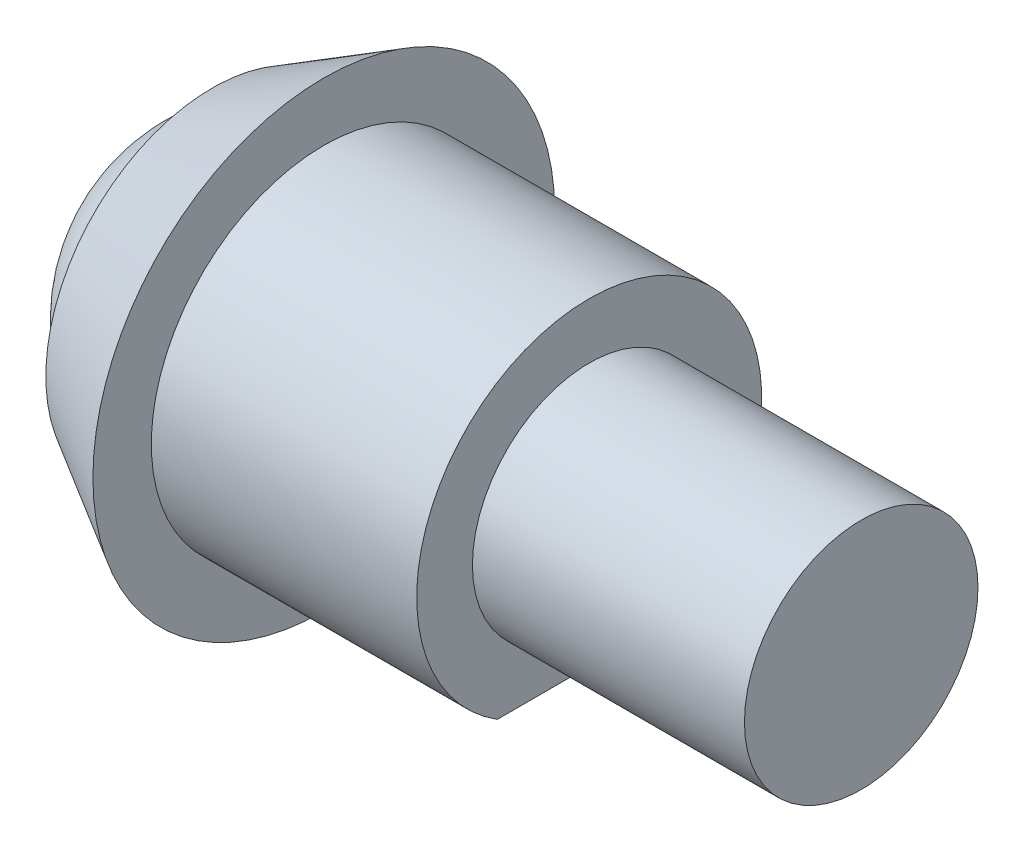
ISO-10303-21;
HEADER;
FILE_DESCRIPTION(('STEP AP214'),'2;1');
FILE_NAME('part.step','',(''),(''),'','','');
FILE_SCHEMA(('AUTOMOTIVE_DESIGN { 1 0 10303 214 1 1 1 1 }'));
ENDSEC;
DATA;
#1=APPLICATION_CONTEXT('core data for automotive mechanical design processes');
#2=APPLICATION_PROTOCOL_DEFINITION('international standard','automotive_design',2000,#1);
#3=PRODUCT_CONTEXT('',#1,'mechanical');
#4=PRODUCT('Part','Part','',(#3));
#5=PRODUCT_RELATED_PRODUCT_CATEGORY('part','',(#4));
#6=PRODUCT_DEFINITION_FORMATION('','',#4);
#7=PRODUCT_DEFINITION_CONTEXT('part definition',#1,'design');
#8=PRODUCT_DEFINITION('design','',#6,#7);
#9=PRODUCT_DEFINITION_SHAPE('','',#8);
#10=(LENGTH_UNIT() NAMED_UNIT(*) SI_UNIT(.MILLI.,.METRE.));
#11=(NAMED_UNIT(*) PLANE_ANGLE_UNIT() SI_UNIT($,.RADIAN.));
#12=(NAMED_UNIT(*) SI_UNIT($,.STERADIAN.) SOLID_ANGLE_UNIT());
#13=UNCERTAINTY_MEASURE_WITH_UNIT(LENGTH_MEASURE(1.E-05),#10,'distance_accuracy_value','');
#14=(GEOMETRIC_REPRESENTATION_CONTEXT(3) GLOBAL_UNCERTAINTY_ASSIGNED_CONTEXT((#13)) GLOBAL_UNIT_ASSIGNED_CONTEXT((#10,
#11,#12)) REPRESENTATION_CONTEXT('',''));
#15=CARTESIAN_POINT('',(0.,0.,0.));
#16=DIRECTION('',(0.,0.,1.));
#17=DIRECTION('',(1.,0.,0.));
#18=AXIS2_PLACEMENT_3D('',#15,#16,#17);
#19=CARTESIAN_POINT('',(-1.575,0.,0.));
#20=DIRECTION('',(0.,-1.,0.));
#21=DIRECTION('',(0.,0.,-1.));
#22=AXIS2_PLACEMENT_3D('',#19,#20,#21);
#23=SPHERICAL_SURFACE('',#22,6.175);
#24=CARTESIAN_POINT('',(-4.2,5.58927544499285,0.));
#25=CARTESIAN_POINT('',(-4.2,5.5892745786909,-0.156929164661286));
#26=CARTESIAN_POINT('',(-4.2,5.58266080312871,-0.313886777360386));
#27=CARTESIAN_POINT('',(-4.2,5.55624664555903,-0.626719865022268));
#28=CARTESIAN_POINT('',(-4.2,5.53644237045213,-0.782595006772041));
#29=CARTESIAN_POINT('',(-4.2,5.48374292698726,-1.09237594318078));
#30=CARTESIAN_POINT('',(-4.2,5.45082697835194,-1.24627820951557));
#31=CARTESIAN_POINT('',(-4.2,5.37210650130169,-1.55088301447486));
#32=CARTESIAN_POINT('',(-4.2,5.32629151368527,-1.70158284931269));
#33=CARTESIAN_POINT('',(-4.2,5.2222006563945,-1.99832431331658));
#34=CARTESIAN_POINT('',(-4.2,5.16394637734744,-2.14437351610486));
#35=CARTESIAN_POINT('',(-4.2,5.03531511456328,-2.43111170680229));
#36=CARTESIAN_POINT('',(-4.2,4.96493265292254,-2.5717982373495));
#37=CARTESIAN_POINT('',(-4.2,4.81256093532243,-2.84674576744194));
#38=CARTESIAN_POINT('',(-4.2,4.73057124274869,-2.98100652502277));
#39=CARTESIAN_POINT('',(-4.2,4.55560984921689,-3.24208279881878));
#40=CARTESIAN_POINT('',(-4.2,4.46264312590842,-3.36890165088629));
#41=CARTESIAN_POINT('',(-4.2,4.26629517047056,-3.61433801478617));
#42=CARTESIAN_POINT('',(-4.2,4.16290724764479,-3.7329501742314));
#43=CARTESIAN_POINT('',(-4.2,3.94660717150504,-3.96092894546017));
#44=CARTESIAN_POINT('',(-4.2,3.83370429709174,-4.07030436108395));
#45=CARTESIAN_POINT('',(-4.2,3.5990370403727,-4.27920797290112));
#46=CARTESIAN_POINT('',(-4.2,3.47726866704603,-4.37873168594271));
#47=CARTESIAN_POINT('',(-4.2,3.22575205757425,-4.567189908093));
#48=CARTESIAN_POINT('',(-4.2,3.09600197973476,-4.65612195928345));
#49=CARTESIAN_POINT('',(-4.2,2.82951524487939,-4.8227094889278));
#50=CARTESIAN_POINT('',(-4.2,2.69278096228403,-4.90036876574409));
#51=CARTESIAN_POINT('',(-4.2,2.41320565397912,-5.04392108715214));
#52=CARTESIAN_POINT('',(-4.2,2.27036239657882,-5.10980978549267));
#53=CARTESIAN_POINT('',(-4.2,1.97968779267803,-5.22929430491891));
#54=CARTESIAN_POINT('',(-4.2,1.83185837215084,-5.282894811498));
#55=CARTESIAN_POINT('',(-4.2,1.53215407946375,-5.3774719846928));
#56=CARTESIAN_POINT('',(-4.2,1.38027771392051,-5.41844391907627));
#57=CARTESIAN_POINT('',(-4.2,1.07367555251971,-5.48743125764416));
#58=CARTESIAN_POINT('',(-4.2,0.918950945109569,-5.51545194387125));
#59=CARTESIAN_POINT('',(-4.2,0.607620874014086,-5.55837207885894));
#60=CARTESIAN_POINT('',(-4.2,0.451014589781838,-5.57326557591046));
#61=CARTESIAN_POINT('',(-4.2,0.137104015739795,-5.58980373794042));
#62=CARTESIAN_POINT('',(-4.2,-0.0202002740699995,-5.59144840291886));
#63=CARTESIAN_POINT('',(-4.2,-0.334316768233611,-5.58147948873314));
#64=CARTESIAN_POINT('',(-4.2,-0.491129163204333,-5.56987191455053));
#65=CARTESIAN_POINT('',(-4.2,-0.803282983575508,-5.53348330800936));
#66=CARTESIAN_POINT('',(-4.2,-0.958623782128673,-5.50869689797058));
#67=CARTESIAN_POINT('',(-4.2,-1.26660682189986,-5.44613531264954));
#68=CARTESIAN_POINT('',(-4.2,-1.4192500509854,-5.40836500032252));
#69=CARTESIAN_POINT('',(-4.2,-1.72087057783347,-5.32008514124191));
#70=CARTESIAN_POINT('',(-4.2,-1.86984645262214,-5.26957073255794));
#71=CARTESIAN_POINT('',(-4.2,-2.16295810012761,-5.15619002832633));
#72=CARTESIAN_POINT('',(-4.2,-2.30709563548984,-5.09332828946877));
#73=CARTESIAN_POINT('',(-4.2,-2.58961163644043,-4.95566459020941));
#74=CARTESIAN_POINT('',(-4.2,-2.72798813987323,-4.88085860297572));
#75=CARTESIAN_POINT('',(-4.2,-2.99791499465379,-4.71987227000145));
#76=CARTESIAN_POINT('',(-4.2,-3.12946691922991,-4.63369456209199));
#77=CARTESIAN_POINT('',(-4.2,-3.3847860372038,-4.45060554438931));
#78=CARTESIAN_POINT('',(-4.2,-3.5085567284526,-4.35369911229396));
#79=CARTESIAN_POINT('',(-4.2,-3.74761470471133,-4.14971056590929));
#80=CARTESIAN_POINT('',(-4.2,-3.8628936872685,-4.04261872151827));
#81=CARTESIAN_POINT('',(-4.2,-4.0839443867678,-3.81917271779502));
#82=CARTESIAN_POINT('',(-4.2,-4.18972219495464,-3.70282458425767));
#83=CARTESIAN_POINT('',(-4.2,-4.39114812083514,-3.46157801671943));
#84=CARTESIAN_POINT('',(-4.2,-4.48679163895625,-3.33667574229687));
#85=CARTESIAN_POINT('',(-4.2,-4.66721049276818,-3.07926105387073));
#86=CARTESIAN_POINT('',(-4.2,-4.75198623723142,-2.94674892637016));
#87=CARTESIAN_POINT('',(-4.2,-4.91003498801571,-2.6751142744102));
#88=CARTESIAN_POINT('',(-4.2,-4.9833131837031,-2.5359947693105));
#89=CARTESIAN_POINT('',(-4.2,-5.118008496003,-2.25183358991554));
#90=CARTESIAN_POINT('',(-4.2,-5.17940493732518,-2.10678211524736));
#91=CARTESIAN_POINT('',(-4.2,-5.28969657346066,-1.81213528307389));
#92=CARTESIAN_POINT('',(-4.2,-5.33860188546859,-1.6625437134085));
#93=CARTESIAN_POINT('',(-4.2,-5.4235604302329,-1.36001519314089));
#94=CARTESIAN_POINT('',(-4.2,-5.45963395748334,-1.20708393485883));
#95=CARTESIAN_POINT('',(-4.2,-5.51877344005076,-0.898758181705059));
#96=CARTESIAN_POINT('',(-4.19999999999999,-5.54184323190228,-0.743364427276785));
#97=CARTESIAN_POINT('',(-4.2,-5.56863942534235,-0.489774646104385));
#98=CARTESIAN_POINT('',(-4.2,-5.57637551666459,-0.391984856877032));
#99=CARTESIAN_POINT('',(-4.2,-5.58669379718629,-0.196133748644609));
#100=CARTESIAN_POINT('',(-4.2,-5.58927598638576,-0.0980724296395377));
#101=CARTESIAN_POINT('',(-4.2,-5.5892745786909,0.156929164661287));
#102=CARTESIAN_POINT('',(-4.2,-5.58266080312871,0.313886777360387));
#103=CARTESIAN_POINT('',(-4.2,-5.55624664555903,0.626719865022269));
#104=CARTESIAN_POINT('',(-4.2,-5.53644237045213,0.782595006772042));
#105=CARTESIAN_POINT('',(-4.2,-5.48374292698726,1.09237594318079));
#106=CARTESIAN_POINT('',(-4.2,-5.45082697835194,1.24627820951557));
#107=CARTESIAN_POINT('',(-4.2,-5.37210650130169,1.55088301447486));
#108=CARTESIAN_POINT('',(-4.2,-5.32629151368527,1.70158284931269));
#109=CARTESIAN_POINT('',(-4.2,-5.2222006563945,1.99832431331658));
#110=CARTESIAN_POINT('',(-4.2,-5.16394637734743,2.14437351610486));
#111=CARTESIAN_POINT('',(-4.2,-5.03531511456328,2.43111170680229));
#112=CARTESIAN_POINT('',(-4.2,-4.96493265292253,2.5717982373495));
#113=CARTESIAN_POINT('',(-4.2,-4.81256093532243,2.84674576744194));
#114=CARTESIAN_POINT('',(-4.2,-4.73057124274869,2.98100652502277));
#115=CARTESIAN_POINT('',(-4.2,-4.55560984921689,3.24208279881878));
#116=CARTESIAN_POINT('',(-4.2,-4.46264312590842,3.36890165088629));
#117=CARTESIAN_POINT('',(-4.2,-4.26629517047056,3.61433801478617));
#118=CARTESIAN_POINT('',(-4.2,-4.16290724764479,3.7329501742314));
#119=CARTESIAN_POINT('',(-4.2,-3.94660717150504,3.96092894546018));
#120=CARTESIAN_POINT('',(-4.2,-3.83370429709174,4.07030436108395));
#121=CARTESIAN_POINT('',(-4.2,-3.5990370403727,4.27920797290112));
#122=CARTESIAN_POINT('',(-4.2,-3.47726866704603,4.37873168594271));
#123=CARTESIAN_POINT('',(-4.2,-3.22575205757425,4.567189908093));
#124=CARTESIAN_POINT('',(-4.2,-3.09600197973476,4.65612195928345));
#125=CARTESIAN_POINT('',(-4.2,-2.82951524487939,4.82270948892781));
#126=CARTESIAN_POINT('',(-4.2,-2.69278096228403,4.90036876574409));
#127=CARTESIAN_POINT('',(-4.2,-2.41320565397912,5.04392108715214));
#128=CARTESIAN_POINT('',(-4.2,-2.27036239657882,5.10980978549267));
#129=CARTESIAN_POINT('',(-4.2,-1.97968779267803,5.22929430491891));
#130=CARTESIAN_POINT('',(-4.2,-1.83185837215084,5.282894811498));
#131=CARTESIAN_POINT('',(-4.2,-1.53215407946375,5.3774719846928));
#132=CARTESIAN_POINT('',(-4.2,-1.38027771392051,5.41844391907626));
#133=CARTESIAN_POINT('',(-4.2,-1.07367555251971,5.48743125764415));
#134=CARTESIAN_POINT('',(-4.2,-0.918950945109569,5.51545194387125));
#135=CARTESIAN_POINT('',(-4.2,-0.607620874014085,5.55837207885894));
#136=CARTESIAN_POINT('',(-4.2,-0.451014589781838,5.57326557591046));
#137=CARTESIAN_POINT('',(-4.2,-0.137104015739795,5.58980373794042));
#138=CARTESIAN_POINT('',(-4.2,0.0202002740700001,5.59144840291886));
#139=CARTESIAN_POINT('',(-4.2,0.334316768233612,5.58147948873314));
#140=CARTESIAN_POINT('',(-4.2,0.491129163204334,5.56987191455053));
#141=CARTESIAN_POINT('',(-4.2,0.803282983575509,5.53348330800936));
#142=CARTESIAN_POINT('',(-4.2,0.958623782128674,5.50869689797058));
#143=CARTESIAN_POINT('',(-4.2,1.26660682189987,5.44613531264954));
#144=CARTESIAN_POINT('',(-4.2,1.4192500509854,5.40836500032252));
#145=CARTESIAN_POINT('',(-4.2,1.72087057783347,5.32008514124191));
#146=CARTESIAN_POINT('',(-4.2,1.86984645262214,5.26957073255794));
#147=CARTESIAN_POINT('',(-4.2,2.16295810012761,5.15619002832633));
#148=CARTESIAN_POINT('',(-4.2,2.30709563548985,5.09332828946877));
#149=CARTESIAN_POINT('',(-4.2,2.58961163644043,4.95566459020941));
#150=CARTESIAN_POINT('',(-4.2,2.72798813987323,4.88085860297572));
#151=CARTESIAN_POINT('',(-4.2,2.99791499465379,4.71987227000145));
#152=CARTESIAN_POINT('',(-4.2,3.12946691922991,4.63369456209199));
#153=CARTESIAN_POINT('',(-4.2,3.3847860372038,4.45060554438931));
#154=CARTESIAN_POINT('',(-4.2,3.50855672845261,4.35369911229396));
#155=CARTESIAN_POINT('',(-4.2,3.74761470471133,4.14971056590929));
#156=CARTESIAN_POINT('',(-4.2,3.8628936872685,4.04261872151827));
#157=CARTESIAN_POINT('',(-4.2,4.0839443867678,3.81917271779502));
#158=CARTESIAN_POINT('',(-4.2,4.18972219495464,3.70282458425767));
#159=CARTESIAN_POINT('',(-4.2,4.39114812083514,3.46157801671943));
#160=CARTESIAN_POINT('',(-4.2,4.48679163895625,3.33667574229687));
#161=CARTESIAN_POINT('',(-4.2,4.66721049276818,3.07926105387072));
#162=CARTESIAN_POINT('',(-4.2,4.75198623723142,2.94674892637016));
#163=CARTESIAN_POINT('',(-4.2,4.91003498801571,2.6751142744102));
#164=CARTESIAN_POINT('',(-4.2,4.9833131837031,2.53599476931049));
#165=CARTESIAN_POINT('',(-4.2,5.118008496003,2.25183358991554));
#166=CARTESIAN_POINT('',(-4.2,5.17940493732518,2.10678211524736));
#167=CARTESIAN_POINT('',(-4.2,5.28969657346066,1.81213528307388));
#168=CARTESIAN_POINT('',(-4.2,5.33860188546859,1.6625437134085));
#169=CARTESIAN_POINT('',(-4.2,5.4235604302329,1.36001519314089));
#170=CARTESIAN_POINT('',(-4.2,5.45963395748334,1.20708393485883));
#171=CARTESIAN_POINT('',(-4.2,5.51877344005076,0.89875818170506));
#172=CARTESIAN_POINT('',(-4.19999999999999,5.54184323190228,0.743364427276785));
#173=CARTESIAN_POINT('',(-4.2,5.56863942534235,0.489774646104385));
#174=CARTESIAN_POINT('',(-4.2,5.57637551666459,0.391984856877033));
#175=CARTESIAN_POINT('',(-4.2,5.58669379718629,0.196133748644609));
#176=CARTESIAN_POINT('',(-4.2,5.58927598638576,0.0980724296395385));
#177=CARTESIAN_POINT('',(-4.2,5.58927544499285,0.));
#178=B_SPLINE_CURVE_WITH_KNOTS('',3,(#24,#25,#26,#27,#28,#29,#30,#31,#32,#33,#34,#35,#36,#37,
#38,#39,#40,#41,#42,#43,#44,#45,#46,#47,#48,#49,#50,#51,#52,#53,#54,#55,#56,#57,#58,#59,#60,#61,
#62,#63,#64,#65,#66,#67,#68,#69,#70,#71,#72,#73,#74,#75,#76,#77,#78,#79,#80,#81,#82,#83,#84,#85,
#86,#87,#88,#89,#90,#91,#92,#93,#94,#95,#96,#97,#98,#99,#100,#101,#102,#103,#104,#105,#106,#107,
#108,#109,#110,#111,#112,#113,#114,#115,#116,#117,#118,#119,#120,#121,#122,#123,#124,#125,#126,
#127,#128,#129,#130,#131,#132,#133,#134,#135,#136,#137,#138,#139,#140,#141,#142,#143,#144,#145,
#146,#147,#148,#149,#150,#151,#152,#153,#154,#155,#156,#157,#158,#159,#160,#161,#162,#163,#164,
#165,#166,#167,#168,#169,#170,#171,#172,#173,#174,#175,#176,#177),.UNSPECIFIED.,.T.,.F.,(4,2,2,
2,2,2,2,2,2,2,2,2,2,2,2,2,2,2,2,2,2,2,2,2,2,2,2,2,2,2,2,2,2,2,2,2,2,2,2,2,2,2,2,2,2,2,2,2,2,2,2,
2,2,2,2,2,2,2,2,2,2,2,2,2,2,2,2,2,2,2,2,2,2,2,2,2,4),(0.,0.470697694496428,0.941534374284041,
1.41312025629183,1.88508963104007,2.35624638172346,2.82761649898986,3.29900435189683,
3.77017926408083,4.2416586339904,4.71268342677529,5.18392158984141,5.65526889699734,
6.12645701311996,6.59781875605125,7.06900046848075,7.54035853006754,8.01152418277997,
8.48290334658808,8.95428251039618,9.42544816310862,9.89680622469541,10.3679879371249,
10.8393496800562,11.3105377961788,11.7818851033347,12.2531232664009,12.7241480591858,
13.1956274290953,13.6668023412793,14.1381901941863,14.6095603114527,15.0807170621361,
15.5526864368843,16.0242723188921,16.4951089986797,16.9658066931761,17.2599678621636,
17.5541290311511,18.0248267256475,18.4956634054352,18.9672492874429,19.4392186621912,
19.9103754128746,20.381745530141,20.8531333830479,21.3243082952319,21.7957876651415,
22.2668124579264,22.7380506209925,23.2093979281485,23.6805860442711,24.1519477872024,
24.6231294996319,25.0944875612187,25.5656532139311,26.0370323777392,26.5084115415473,
26.9795771942597,27.4509352558465,27.922116968276,28.3934787112073,28.8646668273299,
29.3360141344859,29.807252297552,30.2782770903369,30.7497564602465,31.2209313724305,
31.6923192253374,32.1636893426038,32.6348460932872,33.1068154680354,33.5784013500432,
34.0492380298308,34.5199357243273,34.8140968933148,35.1082580623022),.UNSPECIFIED.);
#179=CARTESIAN_POINT('',(-4.2,5.58927544499285,0.));
#180=VERTEX_POINT('',#179);
#181=EDGE_CURVE('E19',#180,#180,#178,.T.);
#182=ORIENTED_EDGE('',*,*,#181,.T.);
#183=EDGE_LOOP('',(#182));
#184=FACE_BOUND('',#183,.T.);
#185=ADVANCED_FACE('F14',(#184),#23,.T.);
#186=CARTESIAN_POINT('',(20.25,0.,0.));
#187=DIRECTION('',(1.,0.,0.));
#188=DIRECTION('',(0.,0.,-1.));
#189=AXIS2_PLACEMENT_3D('',#186,#187,#188);
#190=PLANE('',#189);
#191=CARTESIAN_POINT('',(20.25,0.,0.));
#192=DIRECTION('',(1.,0.,0.));
#193=DIRECTION('',(0.,0.,-1.));
#194=AXIS2_PLACEMENT_3D('',#191,#192,#193);
#195=CIRCLE('',#194,4.4);
#196=CARTESIAN_POINT('',(20.25,0.,-4.4));
#197=VERTEX_POINT('',#196);
#198=EDGE_CURVE('E70',#197,#197,#195,.F.);
#199=ORIENTED_EDGE('',*,*,#198,.F.);
#200=EDGE_LOOP('',(#199));
#201=FACE_BOUND('',#200,.T.);
#202=ADVANCED_FACE('F82',(#201),#190,.T.);
#203=CARTESIAN_POINT('',(-4.2,0.,0.));
#204=DIRECTION('',(1.,0.,0.));
#205=DIRECTION('',(0.,0.,-1.));
#206=AXIS2_PLACEMENT_3D('',#203,#204,#205);
#207=PLANE('',#206);
#208=ORIENTED_EDGE('',*,*,#181,.F.);
#209=EDGE_LOOP('',(#208));
#210=FACE_BOUND('',#209,.T.);
#211=CARTESIAN_POINT('',(-4.20000000000003,0.,0.));
#212=DIRECTION('',(1.,0.,0.));
#213=DIRECTION('',(0.,0.,-1.));
#214=AXIS2_PLACEMENT_3D('',#211,#212,#213);
#215=CIRCLE('',#214,6.27512886940405);
#216=CARTESIAN_POINT('',(-4.20000000000003,0.,-6.27512886940405));
#217=VERTEX_POINT('',#216);
#218=EDGE_CURVE('E68',#217,#217,#215,.T.);
#219=ORIENTED_EDGE('',*,*,#218,.F.);
#220=EDGE_LOOP('',(#219));
#221=FACE_BOUND('',#220,.T.);
#222=ADVANCED_FACE('F78',(#210,#221),#207,.F.);
#223=CARTESIAN_POINT('',(-9.15,0.,0.));
#224=DIRECTION('',(1.,0.,0.));
#225=DIRECTION('',(0.,0.,-1.));
#226=AXIS2_PLACEMENT_3D('',#223,#224,#225);
#227=CYLINDRICAL_SURFACE('',#226,4.4);
#228=ORIENTED_EDGE('',*,*,#198,.T.);
#229=EDGE_LOOP('',(#228));
#230=FACE_BOUND('',#229,.T.);
#231=CARTESIAN_POINT('',(10.,0.,0.));
#232=DIRECTION('',(1.,0.,0.));
#233=DIRECTION('',(0.,0.,-1.));
#234=AXIS2_PLACEMENT_3D('',#231,#232,#233);
#235=CIRCLE('',#234,4.4);
#236=CARTESIAN_POINT('',(10.,0.,-4.4));
#237=VERTEX_POINT('',#236);
#238=EDGE_CURVE('E52',#237,#237,#235,.F.);
#239=ORIENTED_EDGE('',*,*,#238,.F.);
#240=EDGE_LOOP('',(#239));
#241=FACE_BOUND('',#240,.T.);
#242=ADVANCED_FACE('F81',(#230,#241),#227,.T.);
#243=CARTESIAN_POINT('',(0.,0.,0.));
#244=DIRECTION('',(1.,0.,0.));
#245=DIRECTION('',(0.,0.,-1.));
#246=AXIS2_PLACEMENT_3D('',#243,#244,#245);
#247=CONICAL_SURFACE('',#246,8.69999999999995,0.5235987755982);
#248=CARTESIAN_POINT('',(0.,0.,0.));
#249=DIRECTION('',(1.,0.,0.));
#250=DIRECTION('',(0.,0.,-1.));
#251=AXIS2_PLACEMENT_3D('',#248,#249,#250);
#252=CIRCLE('',#251,8.69999999999995);
#253=CARTESIAN_POINT('',(0.,0.,-8.69999999999995));
#254=VERTEX_POINT('',#253);
#255=EDGE_CURVE('E51',#254,#254,#252,.T.);
#256=ORIENTED_EDGE('',*,*,#255,.F.);
#257=EDGE_LOOP('',(#256));
#258=FACE_BOUND('',#257,.T.);
#259=ORIENTED_EDGE('',*,*,#218,.T.);
#260=EDGE_LOOP('',(#259));
#261=FACE_BOUND('',#260,.T.);
#262=ADVANCED_FACE('F85',(#258,#261),#247,.T.);
#263=CARTESIAN_POINT('',(10.,0.,0.));
#264=DIRECTION('',(1.,0.,0.));
#265=DIRECTION('',(0.,0.,-1.));
#266=AXIS2_PLACEMENT_3D('',#263,#264,#265);
#267=PLANE('',#266);
#268=ORIENTED_EDGE('',*,*,#238,.T.);
#269=EDGE_LOOP('',(#268));
#270=FACE_BOUND('',#269,.T.);
#271=CARTESIAN_POINT('',(10.,0.,0.));
#272=DIRECTION('',(1.,0.,0.));
#273=DIRECTION('',(0.,0.,-1.));
#274=AXIS2_PLACEMENT_3D('',#271,#272,#273);
#275=CIRCLE('',#274,6.5);
#276=CARTESIAN_POINT('',(10.,-5.49999999999994,3.46410161513784));
#277=VERTEX_POINT('',#276);
#278=CARTESIAN_POINT('',(10.,-5.49999999999994,-3.46410161513784));
#279=VERTEX_POINT('',#278);
#280=EDGE_CURVE('E54',#277,#279,#275,.F.);
#281=ORIENTED_EDGE('',*,*,#280,.F.);
#282=DIRECTION('',(0.,0.,1.));
#283=VECTOR('',#282,1.);
#284=CARTESIAN_POINT('',(10.,-5.5,-3.464101615138));
#285=LINE('',#284,#283);
#286=EDGE_CURVE('E43',#277,#279,#285,.F.);
#287=ORIENTED_EDGE('',*,*,#286,.T.);
#288=EDGE_LOOP('',(#281,#287));
#289=FACE_BOUND('',#288,.T.);
#290=ADVANCED_FACE('F55',(#270,#289),#267,.T.);
#291=CARTESIAN_POINT('',(10.,-5.5,-3.464101615138));
#292=DIRECTION('',(0.,1.,0.));
#293=DIRECTION('',(0.,0.,1.));
#294=AXIS2_PLACEMENT_3D('',#291,#292,#293);
#295=PLANE('',#294);
#296=DIRECTION('',(0.,0.,-1.));
#297=VECTOR('',#296,1.);
#298=CARTESIAN_POINT('',(0.,-5.5,0.));
#299=LINE('',#298,#297);
#300=CARTESIAN_POINT('',(0.,-5.49999999999994,-3.46410161513784));
#301=VERTEX_POINT('',#300);
#302=CARTESIAN_POINT('',(0.,-5.49999999999994,3.46410161513784));
#303=VERTEX_POINT('',#302);
#304=EDGE_CURVE('E36',#301,#303,#299,.F.);
#305=ORIENTED_EDGE('',*,*,#304,.F.);
#306=DIRECTION('',(1.,0.,0.));
#307=VECTOR('',#306,1.);
#308=CARTESIAN_POINT('',(-9.15,-5.49999999999989,-3.46410161513793));
#309=LINE('',#308,#307);
#310=EDGE_CURVE('E28',#279,#301,#309,.F.);
#311=ORIENTED_EDGE('',*,*,#310,.F.);
#312=ORIENTED_EDGE('',*,*,#286,.F.);
#313=DIRECTION('',(1.,0.,0.));
#314=VECTOR('',#313,1.);
#315=CARTESIAN_POINT('',(-9.15,-5.49999999999989,3.46410161513793));
#316=LINE('',#315,#314);
#317=EDGE_CURVE('E47',#303,#277,#316,.T.);
#318=ORIENTED_EDGE('',*,*,#317,.F.);
#319=EDGE_LOOP('',(#305,#311,#312,#318));
#320=FACE_BOUND('',#319,.T.);
#321=ADVANCED_FACE('F45',(#320),#295,.F.);
#322=CARTESIAN_POINT('',(0.,0.,0.));
#323=DIRECTION('',(1.,0.,0.));
#324=DIRECTION('',(0.,0.,-1.));
#325=AXIS2_PLACEMENT_3D('',#322,#323,#324);
#326=PLANE('',#325);
#327=ORIENTED_EDGE('',*,*,#304,.T.);
#328=CARTESIAN_POINT('',(0.,0.,0.));
#329=DIRECTION('',(1.,0.,0.));
#330=DIRECTION('',(0.,0.,-1.));
#331=AXIS2_PLACEMENT_3D('',#328,#329,#330);
#332=CIRCLE('',#331,6.5);
#333=EDGE_CURVE('E9',#301,#303,#332,.T.);
#334=ORIENTED_EDGE('',*,*,#333,.F.);
#335=EDGE_LOOP('',(#327,#334));
#336=FACE_BOUND('',#335,.T.);
#337=ORIENTED_EDGE('',*,*,#255,.T.);
#338=EDGE_LOOP('',(#337));
#339=FACE_BOUND('',#338,.T.);
#340=ADVANCED_FACE('F99',(#336,#339),#326,.T.);
#341=CARTESIAN_POINT('',(-9.15,0.,0.));
#342=DIRECTION('',(1.,0.,0.));
#343=DIRECTION('',(0.,0.,-1.));
#344=AXIS2_PLACEMENT_3D('',#341,#342,#343);
#345=CYLINDRICAL_SURFACE('',#344,6.5);
#346=ORIENTED_EDGE('',*,*,#310,.T.);
#347=ORIENTED_EDGE('',*,*,#333,.T.);
#348=ORIENTED_EDGE('',*,*,#317,.T.);
#349=ORIENTED_EDGE('',*,*,#280,.T.);
#350=EDGE_LOOP('',(#346,#347,#348,#349));
#351=FACE_BOUND('',#350,.T.);
#352=ADVANCED_FACE('F58',(#351),#345,.T.);
#353=CLOSED_SHELL('',(#185,#202,#222,#242,#262,#290,#321,#340,#352));
#354=MANIFOLD_SOLID_BREP('B1',#353);
#355=ADVANCED_BREP_SHAPE_REPRESENTATION('',(#18,#354),#14);
#356=SHAPE_DEFINITION_REPRESENTATION(#9,#355);
ENDSEC;
END-ISO-10303-21;
